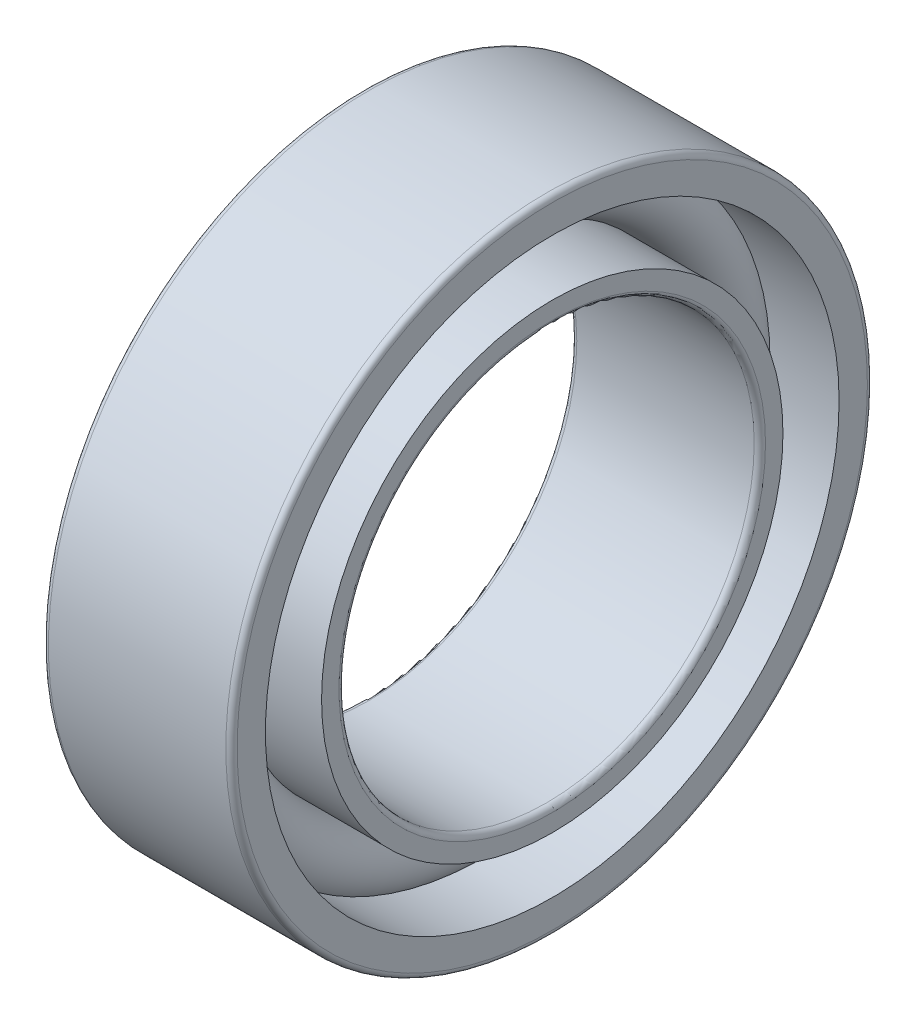
ISO-10303-21;
HEADER;
FILE_DESCRIPTION(('STEP AP214'),'2;1');
FILE_NAME('part.step','',(''),(''),'','','');
FILE_SCHEMA(('AUTOMOTIVE_DESIGN { 1 0 10303 214 1 1 1 1 }'));
ENDSEC;
DATA;
#1=APPLICATION_CONTEXT('core data for automotive mechanical design processes');
#2=APPLICATION_PROTOCOL_DEFINITION('international standard','automotive_design',2000,#1);
#3=PRODUCT_CONTEXT('',#1,'mechanical');
#4=PRODUCT('Part','Part','',(#3));
#5=PRODUCT_RELATED_PRODUCT_CATEGORY('part','',(#4));
#6=PRODUCT_DEFINITION_FORMATION('','',#4);
#7=PRODUCT_DEFINITION_CONTEXT('part definition',#1,'design');
#8=PRODUCT_DEFINITION('design','',#6,#7);
#9=PRODUCT_DEFINITION_SHAPE('','',#8);
#10=(LENGTH_UNIT() NAMED_UNIT(*) SI_UNIT(.MILLI.,.METRE.));
#11=(NAMED_UNIT(*) PLANE_ANGLE_UNIT() SI_UNIT($,.RADIAN.));
#12=(NAMED_UNIT(*) SI_UNIT($,.STERADIAN.) SOLID_ANGLE_UNIT());
#13=UNCERTAINTY_MEASURE_WITH_UNIT(LENGTH_MEASURE(1.E-05),#10,'distance_accuracy_value','');
#14=(GEOMETRIC_REPRESENTATION_CONTEXT(3) GLOBAL_UNCERTAINTY_ASSIGNED_CONTEXT((#13)) GLOBAL_UNIT_ASSIGNED_CONTEXT((#10,
#11,#12)) REPRESENTATION_CONTEXT('',''));
#15=CARTESIAN_POINT('',(0.,0.,0.));
#16=DIRECTION('',(0.,0.,1.));
#17=DIRECTION('',(1.,0.,0.));
#18=AXIS2_PLACEMENT_3D('',#15,#16,#17);
#19=CARTESIAN_POINT('',(0.,0.,0.));
#20=DIRECTION('',(-1.,0.,0.));
#21=DIRECTION('',(0.,0.,1.));
#22=AXIS2_PLACEMENT_3D('',#19,#20,#21);
#23=TOROIDAL_SURFACE('',#22,14.,1.8);
#24=CARTESIAN_POINT('',(1.34164078649988,0.,0.));
#25=DIRECTION('',(-1.,0.,0.));
#26=DIRECTION('',(0.,0.,1.));
#27=AXIS2_PLACEMENT_3D('',#24,#25,#26);
#28=CIRCLE('',#27,15.2);
#29=CARTESIAN_POINT('',(1.34164078649988,0.,15.2));
#30=VERTEX_POINT('',#29);
#31=EDGE_CURVE('E36',#30,#30,#28,.F.);
#32=ORIENTED_EDGE('',*,*,#31,.T.);
#33=EDGE_LOOP('',(#32));
#34=FACE_BOUND('',#33,.T.);
#35=CARTESIAN_POINT('',(0.29895651857753,0.,0.));
#36=DIRECTION('',(-1.,0.,0.));
#37=DIRECTION('',(0.,0.,1.));
#38=AXIS2_PLACEMENT_3D('',#35,#36,#37);
#39=CIRCLE('',#38,12.225);
#40=CARTESIAN_POINT('',(0.29895651857753,0.,12.225));
#41=VERTEX_POINT('',#40);
#42=EDGE_CURVE('E10',#41,#41,#39,.T.);
#43=ORIENTED_EDGE('',*,*,#42,.T.);
#44=EDGE_LOOP('',(#43));
#45=FACE_BOUND('',#44,.T.);
#46=ADVANCED_FACE('F32',(#34,#45),#23,.T.);
#47=CARTESIAN_POINT('',(-20.6375,0.,0.));
#48=DIRECTION('',(1.,0.,0.));
#49=DIRECTION('',(0.,0.,-1.));
#50=AXIS2_PLACEMENT_3D('',#47,#48,#49);
#51=CYLINDRICAL_SURFACE('',#50,12.225);
#52=CARTESIAN_POINT('',(5.,0.,0.));
#53=DIRECTION('',(1.,0.,0.));
#54=DIRECTION('',(0.,0.,-1.));
#55=AXIS2_PLACEMENT_3D('',#52,#53,#54);
#56=CIRCLE('',#55,12.225);
#57=CARTESIAN_POINT('',(5.,0.,-12.225));
#58=VERTEX_POINT('',#57);
#59=EDGE_CURVE('E45',#58,#58,#56,.T.);
#60=ORIENTED_EDGE('',*,*,#59,.F.);
#61=EDGE_LOOP('',(#60));
#62=FACE_BOUND('',#61,.T.);
#63=ORIENTED_EDGE('',*,*,#42,.F.);
#64=EDGE_LOOP('',(#63));
#65=FACE_BOUND('',#64,.T.);
#66=ADVANCED_FACE('F84',(#62,#65),#51,.T.);
#67=CARTESIAN_POINT('',(-20.6375,0.,0.));
#68=DIRECTION('',(1.,0.,0.));
#69=DIRECTION('',(0.,0.,-1.));
#70=AXIS2_PLACEMENT_3D('',#67,#68,#69);
#71=CYLINDRICAL_SURFACE('',#70,12.8);
#72=CARTESIAN_POINT('',(-5.,0.,0.));
#73=DIRECTION('',(1.,0.,0.));
#74=DIRECTION('',(0.,0.,-1.));
#75=AXIS2_PLACEMENT_3D('',#72,#73,#74);
#76=CIRCLE('',#75,12.8);
#77=CARTESIAN_POINT('',(-5.,0.,-12.8));
#78=VERTEX_POINT('',#77);
#79=EDGE_CURVE('E54',#78,#78,#76,.T.);
#80=ORIENTED_EDGE('',*,*,#79,.T.);
#81=EDGE_LOOP('',(#80));
#82=FACE_BOUND('',#81,.T.);
#83=CARTESIAN_POINT('',(-1.34164078649987,0.,0.));
#84=DIRECTION('',(1.,0.,0.));
#85=DIRECTION('',(0.,0.,-1.));
#86=AXIS2_PLACEMENT_3D('',#83,#84,#85);
#87=CIRCLE('',#86,12.8);
#88=CARTESIAN_POINT('',(-1.34164078649987,0.,-12.8));
#89=VERTEX_POINT('',#88);
#90=EDGE_CURVE('E40',#89,#89,#87,.T.);
#91=ORIENTED_EDGE('',*,*,#90,.F.);
#92=EDGE_LOOP('',(#91));
#93=FACE_BOUND('',#92,.T.);
#94=ADVANCED_FACE('F87',(#82,#93),#71,.T.);
#95=CARTESIAN_POINT('',(5.,11.3,0.));
#96=DIRECTION('',(1.,0.,0.));
#97=DIRECTION('',(0.,0.,-1.));
#98=AXIS2_PLACEMENT_3D('',#95,#96,#97);
#99=PLANE('',#98);
#100=ORIENTED_EDGE('',*,*,#59,.T.);
#101=EDGE_LOOP('',(#100));
#102=FACE_BOUND('',#101,.T.);
#103=CARTESIAN_POINT('',(5.,0.,0.));
#104=DIRECTION('',(1.,0.,0.));
#105=DIRECTION('',(0.,0.,-1.));
#106=AXIS2_PLACEMENT_3D('',#103,#104,#105);
#107=CIRCLE('',#106,11.3);
#108=CARTESIAN_POINT('',(5.,0.,-11.3));
#109=VERTEX_POINT('',#108);
#110=EDGE_CURVE('E76',#109,#109,#107,.T.);
#111=ORIENTED_EDGE('',*,*,#110,.F.);
#112=EDGE_LOOP('',(#111));
#113=FACE_BOUND('',#112,.T.);
#114=ADVANCED_FACE('F81',(#102,#113),#99,.T.);
#115=CARTESIAN_POINT('',(4.7,0.,0.));
#116=DIRECTION('',(1.,0.,0.));
#117=DIRECTION('',(0.,0.,-1.));
#118=AXIS2_PLACEMENT_3D('',#115,#116,#117);
#119=TOROIDAL_SURFACE('',#118,11.3,0.3);
#120=ORIENTED_EDGE('',*,*,#110,.T.);
#121=EDGE_LOOP('',(#120));
#122=FACE_BOUND('',#121,.T.);
#123=CARTESIAN_POINT('',(4.7,0.,0.));
#124=DIRECTION('',(1.,0.,0.));
#125=DIRECTION('',(0.,0.,-1.));
#126=AXIS2_PLACEMENT_3D('',#123,#124,#125);
#127=CIRCLE('',#126,11.);
#128=CARTESIAN_POINT('',(4.7,0.,-11.));
#129=VERTEX_POINT('',#128);
#130=EDGE_CURVE('E73',#129,#129,#127,.T.);
#131=ORIENTED_EDGE('',*,*,#130,.F.);
#132=EDGE_LOOP('',(#131));
#133=FACE_BOUND('',#132,.T.);
#134=ADVANCED_FACE('F98',(#122,#133),#119,.T.);
#135=CARTESIAN_POINT('',(-20.6375,0.,0.));
#136=DIRECTION('',(1.,0.,0.));
#137=DIRECTION('',(0.,0.,-1.));
#138=AXIS2_PLACEMENT_3D('',#135,#136,#137);
#139=CYLINDRICAL_SURFACE('',#138,11.);
#140=ORIENTED_EDGE('',*,*,#130,.T.);
#141=EDGE_LOOP('',(#140));
#142=FACE_BOUND('',#141,.T.);
#143=CARTESIAN_POINT('',(-4.7,0.,0.));
#144=DIRECTION('',(1.,0.,0.));
#145=DIRECTION('',(0.,0.,-1.));
#146=AXIS2_PLACEMENT_3D('',#143,#144,#145);
#147=CIRCLE('',#146,11.);
#148=CARTESIAN_POINT('',(-4.7,0.,-11.));
#149=VERTEX_POINT('',#148);
#150=EDGE_CURVE('E70',#149,#149,#147,.T.);
#151=ORIENTED_EDGE('',*,*,#150,.F.);
#152=EDGE_LOOP('',(#151));
#153=FACE_BOUND('',#152,.T.);
#154=ADVANCED_FACE('F101',(#142,#153),#139,.F.);
#155=CARTESIAN_POINT('',(-4.7,0.,0.));
#156=DIRECTION('',(1.,0.,0.));
#157=DIRECTION('',(0.,0.,-1.));
#158=AXIS2_PLACEMENT_3D('',#155,#156,#157);
#159=TOROIDAL_SURFACE('',#158,11.3,0.3);
#160=ORIENTED_EDGE('',*,*,#150,.T.);
#161=EDGE_LOOP('',(#160));
#162=FACE_BOUND('',#161,.T.);
#163=CARTESIAN_POINT('',(-5.,0.,0.));
#164=DIRECTION('',(1.,0.,0.));
#165=DIRECTION('',(0.,0.,-1.));
#166=AXIS2_PLACEMENT_3D('',#163,#164,#165);
#167=CIRCLE('',#166,11.3);
#168=CARTESIAN_POINT('',(-5.,0.,-11.3));
#169=VERTEX_POINT('',#168);
#170=EDGE_CURVE('E67',#169,#169,#167,.T.);
#171=ORIENTED_EDGE('',*,*,#170,.F.);
#172=EDGE_LOOP('',(#171));
#173=FACE_BOUND('',#172,.T.);
#174=ADVANCED_FACE('F105',(#162,#173),#159,.T.);
#175=CARTESIAN_POINT('',(-5.,12.8,0.));
#176=DIRECTION('',(-1.,0.,0.));
#177=DIRECTION('',(0.,0.,1.));
#178=AXIS2_PLACEMENT_3D('',#175,#176,#177);
#179=PLANE('',#178);
#180=ORIENTED_EDGE('',*,*,#170,.T.);
#181=EDGE_LOOP('',(#180));
#182=FACE_BOUND('',#181,.T.);
#183=ORIENTED_EDGE('',*,*,#79,.F.);
#184=EDGE_LOOP('',(#183));
#185=FACE_BOUND('',#184,.T.);
#186=ADVANCED_FACE('F109',(#182,#185),#179,.T.);
#187=CARTESIAN_POINT('',(-0.298956518577509,0.,0.));
#188=DIRECTION('',(1.,0.,0.));
#189=DIRECTION('',(0.,0.,-1.));
#190=AXIS2_PLACEMENT_3D('',#187,#188,#189);
#191=CIRCLE('',#190,15.775);
#192=CARTESIAN_POINT('',(-0.298956518577509,0.,-15.775));
#193=VERTEX_POINT('',#192);
#194=EDGE_CURVE('E48',#193,#193,#191,.F.);
#195=ORIENTED_EDGE('',*,*,#194,.T.);
#196=EDGE_LOOP('',(#195));
#197=FACE_BOUND('',#196,.T.);
#198=ORIENTED_EDGE('',*,*,#90,.T.);
#199=EDGE_LOOP('',(#198));
#200=FACE_BOUND('',#199,.T.);
#201=ADVANCED_FACE('F34',(#197,#200),#23,.T.);
#202=CARTESIAN_POINT('',(-20.6375,0.,0.));
#203=DIRECTION('',(1.,0.,0.));
#204=DIRECTION('',(0.,0.,-1.));
#205=AXIS2_PLACEMENT_3D('',#202,#203,#204);
#206=CYLINDRICAL_SURFACE('',#205,15.2);
#207=CARTESIAN_POINT('',(5.,0.,0.));
#208=DIRECTION('',(1.,0.,0.));
#209=DIRECTION('',(0.,0.,-1.));
#210=AXIS2_PLACEMENT_3D('',#207,#208,#209);
#211=CIRCLE('',#210,15.2);
#212=CARTESIAN_POINT('',(5.,0.,-15.2));
#213=VERTEX_POINT('',#212);
#214=EDGE_CURVE('E150',#213,#213,#211,.T.);
#215=ORIENTED_EDGE('',*,*,#214,.T.);
#216=EDGE_LOOP('',(#215));
#217=FACE_BOUND('',#216,.T.);
#218=ORIENTED_EDGE('',*,*,#31,.F.);
#219=EDGE_LOOP('',(#218));
#220=FACE_BOUND('',#219,.T.);
#221=ADVANCED_FACE('F131',(#217,#220),#206,.F.);
#222=CARTESIAN_POINT('',(-20.6375,0.,0.));
#223=DIRECTION('',(1.,0.,0.));
#224=DIRECTION('',(0.,0.,-1.));
#225=AXIS2_PLACEMENT_3D('',#222,#223,#224);
#226=CYLINDRICAL_SURFACE('',#225,15.775);
#227=CARTESIAN_POINT('',(-5.,0.,0.));
#228=DIRECTION('',(1.,0.,0.));
#229=DIRECTION('',(0.,0.,-1.));
#230=AXIS2_PLACEMENT_3D('',#227,#228,#229);
#231=CIRCLE('',#230,15.775);
#232=CARTESIAN_POINT('',(-5.,0.,-15.775));
#233=VERTEX_POINT('',#232);
#234=EDGE_CURVE('E145',#233,#233,#231,.T.);
#235=ORIENTED_EDGE('',*,*,#234,.F.);
#236=EDGE_LOOP('',(#235));
#237=FACE_BOUND('',#236,.T.);
#238=ORIENTED_EDGE('',*,*,#194,.F.);
#239=EDGE_LOOP('',(#238));
#240=FACE_BOUND('',#239,.T.);
#241=ADVANCED_FACE('F118',(#237,#240),#226,.F.);
#242=CARTESIAN_POINT('',(-4.7,0.,0.));
#243=DIRECTION('',(1.,0.,0.));
#244=DIRECTION('',(0.,0.,-1.));
#245=AXIS2_PLACEMENT_3D('',#242,#243,#244);
#246=TOROIDAL_SURFACE('',#245,16.7,0.3);
#247=CARTESIAN_POINT('',(-5.,0.,0.));
#248=DIRECTION('',(1.,0.,0.));
#249=DIRECTION('',(0.,0.,-1.));
#250=AXIS2_PLACEMENT_3D('',#247,#248,#249);
#251=CIRCLE('',#250,16.7);
#252=CARTESIAN_POINT('',(-5.,0.,-16.7));
#253=VERTEX_POINT('',#252);
#254=EDGE_CURVE('E148',#253,#253,#251,.T.);
#255=ORIENTED_EDGE('',*,*,#254,.T.);
#256=EDGE_LOOP('',(#255));
#257=FACE_BOUND('',#256,.T.);
#258=CARTESIAN_POINT('',(-4.7,0.,0.));
#259=DIRECTION('',(1.,0.,0.));
#260=DIRECTION('',(0.,0.,-1.));
#261=AXIS2_PLACEMENT_3D('',#258,#259,#260);
#262=CIRCLE('',#261,17.);
#263=CARTESIAN_POINT('',(-4.7,0.,-17.));
#264=VERTEX_POINT('',#263);
#265=EDGE_CURVE('E50',#264,#264,#262,.T.);
#266=ORIENTED_EDGE('',*,*,#265,.F.);
#267=EDGE_LOOP('',(#266));
#268=FACE_BOUND('',#267,.T.);
#269=ADVANCED_FACE('F114',(#257,#268),#246,.T.);
#270=CARTESIAN_POINT('',(-20.6375,0.,0.));
#271=DIRECTION('',(1.,0.,0.));
#272=DIRECTION('',(0.,0.,-1.));
#273=AXIS2_PLACEMENT_3D('',#270,#271,#272);
#274=CYLINDRICAL_SURFACE('',#273,17.);
#275=ORIENTED_EDGE('',*,*,#265,.T.);
#276=EDGE_LOOP('',(#275));
#277=FACE_BOUND('',#276,.T.);
#278=CARTESIAN_POINT('',(4.7,0.,0.));
#279=DIRECTION('',(1.,0.,0.));
#280=DIRECTION('',(0.,0.,-1.));
#281=AXIS2_PLACEMENT_3D('',#278,#279,#280);
#282=CIRCLE('',#281,17.);
#283=CARTESIAN_POINT('',(4.7,0.,-17.));
#284=VERTEX_POINT('',#283);
#285=EDGE_CURVE('E56',#284,#284,#282,.T.);
#286=ORIENTED_EDGE('',*,*,#285,.F.);
#287=EDGE_LOOP('',(#286));
#288=FACE_BOUND('',#287,.T.);
#289=ADVANCED_FACE('F117',(#277,#288),#274,.T.);
#290=CARTESIAN_POINT('',(4.7,0.,0.));
#291=DIRECTION('',(1.,0.,0.));
#292=DIRECTION('',(0.,0.,-1.));
#293=AXIS2_PLACEMENT_3D('',#290,#291,#292);
#294=TOROIDAL_SURFACE('',#293,16.7,0.3);
#295=ORIENTED_EDGE('',*,*,#285,.T.);
#296=EDGE_LOOP('',(#295));
#297=FACE_BOUND('',#296,.T.);
#298=CARTESIAN_POINT('',(5.,0.,0.));
#299=DIRECTION('',(1.,0.,0.));
#300=DIRECTION('',(0.,0.,-1.));
#301=AXIS2_PLACEMENT_3D('',#298,#299,#300);
#302=CIRCLE('',#301,16.7);
#303=CARTESIAN_POINT('',(5.,0.,-16.7));
#304=VERTEX_POINT('',#303);
#305=EDGE_CURVE('E61',#304,#304,#302,.T.);
#306=ORIENTED_EDGE('',*,*,#305,.F.);
#307=EDGE_LOOP('',(#306));
#308=FACE_BOUND('',#307,.T.);
#309=ADVANCED_FACE('F122',(#297,#308),#294,.T.);
#310=CARTESIAN_POINT('',(5.,16.7,0.));
#311=DIRECTION('',(1.,0.,0.));
#312=DIRECTION('',(0.,0.,-1.));
#313=AXIS2_PLACEMENT_3D('',#310,#311,#312);
#314=PLANE('',#313);
#315=ORIENTED_EDGE('',*,*,#305,.T.);
#316=EDGE_LOOP('',(#315));
#317=FACE_BOUND('',#316,.T.);
#318=ORIENTED_EDGE('',*,*,#214,.F.);
#319=EDGE_LOOP('',(#318));
#320=FACE_BOUND('',#319,.T.);
#321=ADVANCED_FACE('F125',(#317,#320),#314,.T.);
#322=CARTESIAN_POINT('',(-5.,15.775,0.));
#323=DIRECTION('',(-1.,0.,0.));
#324=DIRECTION('',(0.,0.,1.));
#325=AXIS2_PLACEMENT_3D('',#322,#323,#324);
#326=PLANE('',#325);
#327=ORIENTED_EDGE('',*,*,#234,.T.);
#328=EDGE_LOOP('',(#327));
#329=FACE_BOUND('',#328,.T.);
#330=ORIENTED_EDGE('',*,*,#254,.F.);
#331=EDGE_LOOP('',(#330));
#332=FACE_BOUND('',#331,.T.);
#333=ADVANCED_FACE('F129',(#329,#332),#326,.T.);
#334=CLOSED_SHELL('',(#46,#66,#94,#114,#134,#154,#174,#186,#201,#221,#241,#269,#289,#309,#321,#333));
#335=MANIFOLD_SOLID_BREP('B2',#334);
#336=ADVANCED_BREP_SHAPE_REPRESENTATION('',(#18,#335),#14);
#337=SHAPE_DEFINITION_REPRESENTATION(#9,#336);
ENDSEC;
END-ISO-10303-21;
